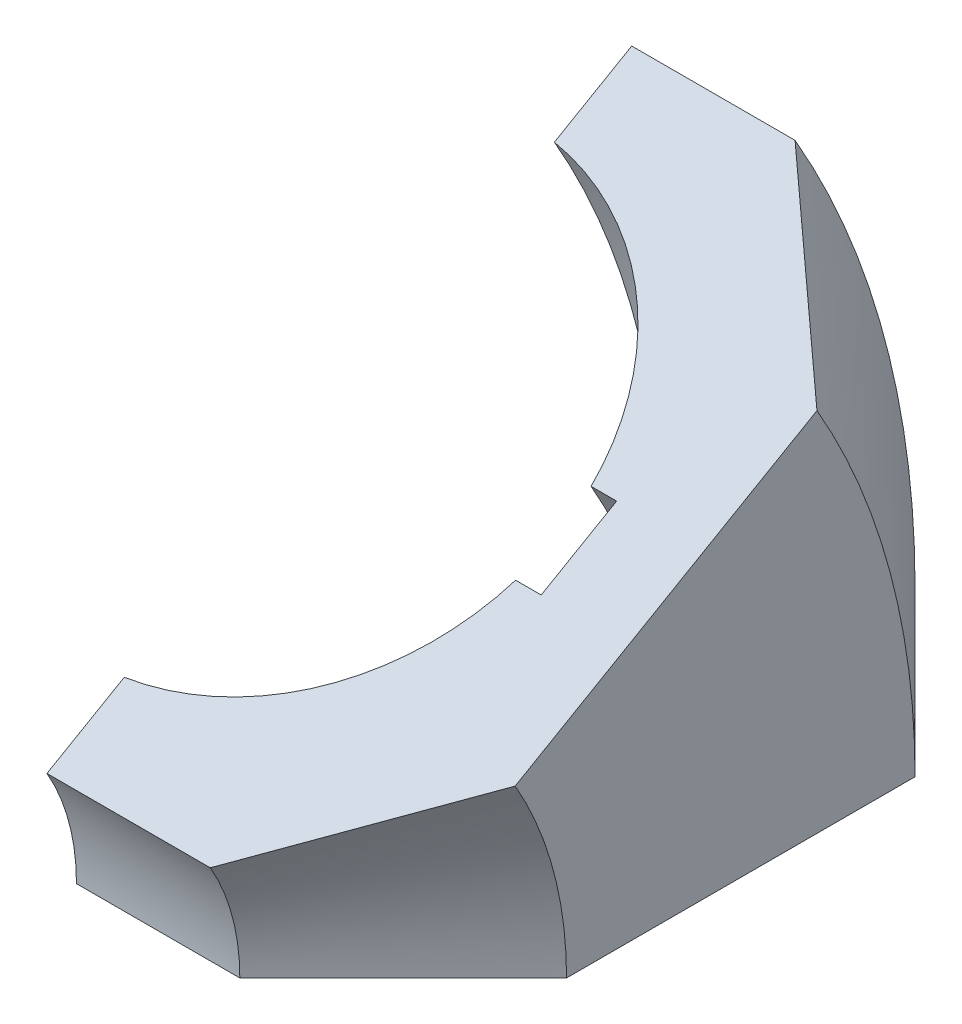
ISO-10303-21;
HEADER;
FILE_DESCRIPTION(('STEP AP214'),'2;1');
FILE_NAME('part.step','',(''),(''),'','','');
FILE_SCHEMA(('AUTOMOTIVE_DESIGN { 1 0 10303 214 1 1 1 1 }'));
ENDSEC;
DATA;
#1=APPLICATION_CONTEXT('core data for automotive mechanical design processes');
#2=APPLICATION_PROTOCOL_DEFINITION('international standard','automotive_design',2000,#1);
#3=PRODUCT_CONTEXT('',#1,'mechanical');
#4=PRODUCT('Part','Part','',(#3));
#5=PRODUCT_RELATED_PRODUCT_CATEGORY('part','',(#4));
#6=PRODUCT_DEFINITION_FORMATION('','',#4);
#7=PRODUCT_DEFINITION_CONTEXT('part definition',#1,'design');
#8=PRODUCT_DEFINITION('design','',#6,#7);
#9=PRODUCT_DEFINITION_SHAPE('','',#8);
#10=(LENGTH_UNIT() NAMED_UNIT(*) SI_UNIT(.MILLI.,.METRE.));
#11=(NAMED_UNIT(*) PLANE_ANGLE_UNIT() SI_UNIT($,.RADIAN.));
#12=(NAMED_UNIT(*) SI_UNIT($,.STERADIAN.) SOLID_ANGLE_UNIT());
#13=UNCERTAINTY_MEASURE_WITH_UNIT(LENGTH_MEASURE(1.E-05),#10,'distance_accuracy_value','');
#14=(GEOMETRIC_REPRESENTATION_CONTEXT(3) GLOBAL_UNCERTAINTY_ASSIGNED_CONTEXT((#13)) GLOBAL_UNIT_ASSIGNED_CONTEXT((#10,
#11,#12)) REPRESENTATION_CONTEXT('',''));
#15=CARTESIAN_POINT('',(0.,0.,0.));
#16=DIRECTION('',(0.,0.,1.));
#17=DIRECTION('',(1.,0.,0.));
#18=AXIS2_PLACEMENT_3D('',#15,#16,#17);
#19=CARTESIAN_POINT('',(0.,25.6217782649108,6.86533479473208));
#20=DIRECTION('',(0.,-0.866025403784447,-0.499999999999986));
#21=DIRECTION('',(0.,0.499999999999986,-0.866025403784447));
#22=AXIS2_PLACEMENT_3D('',#19,#20,#21);
#23=PLANE('',#22);
#24=DIRECTION('',(1.,0.,0.));
#25=VECTOR('',#24,1.);
#26=CARTESIAN_POINT('',(33.,10.1217782649112,33.71212231205));
#27=LINE('',#26,#25);
#28=CARTESIAN_POINT('',(3.00000000000001,10.1217782649112,33.71212231205));
#29=VERTEX_POINT('',#28);
#30=CARTESIAN_POINT('',(18.,10.1217782649112,33.71212231205));
#31=VERTEX_POINT('',#30);
#32=EDGE_CURVE('E209',#29,#31,#27,.T.);
#33=ORIENTED_EDGE('',*,*,#32,.T.);
#34=DIRECTION('',(0.707106781186549,0.353553390593264,-0.612372435695799));
#35=VECTOR('',#34,1.);
#36=CARTESIAN_POINT('',(-2.24355652982317,0.,51.2435565298233));
#37=LINE('',#36,#35);
#38=CARTESIAN_POINT('',(33.,17.621778264911,20.7217412552833));
#39=VERTEX_POINT('',#38);
#40=EDGE_CURVE('E48',#31,#39,#37,.T.);
#41=ORIENTED_EDGE('',*,*,#40,.T.);
#42=DIRECTION('',(0.,0.499999999999986,-0.866025403784447));
#43=VECTOR('',#42,1.);
#44=CARTESIAN_POINT('',(33.,41.1217782649103,-19.9814527225857));
#45=LINE('',#44,#43);
#46=CARTESIAN_POINT('',(33.,33.6217782649105,-6.99107166581893));
#47=VERTEX_POINT('',#46);
#48=EDGE_CURVE('E219',#39,#47,#45,.T.);
#49=ORIENTED_EDGE('',*,*,#48,.T.);
#50=DIRECTION('',(0.707106781186546,-0.353553390593265,0.612372435695802));
#51=VECTOR('',#50,1.);
#52=CARTESIAN_POINT('',(100.243556529823,0.,51.2435565298233));
#53=LINE('',#52,#51);
#54=CARTESIAN_POINT('',(18.,41.1217782649103,-19.9814527225857));
#55=VERTEX_POINT('',#54);
#56=EDGE_CURVE('E55',#47,#55,#53,.F.);
#57=ORIENTED_EDGE('',*,*,#56,.T.);
#58=DIRECTION('',(-1.,0.,0.));
#59=VECTOR('',#58,1.);
#60=CARTESIAN_POINT('',(3.,41.1217782649103,-19.9814527225857));
#61=LINE('',#60,#59);
#62=CARTESIAN_POINT('',(3.,41.1217782649103,-19.9814527225857));
#63=VERTEX_POINT('',#62);
#64=EDGE_CURVE('E145',#55,#63,#61,.T.);
#65=ORIENTED_EDGE('',*,*,#64,.T.);
#66=DIRECTION('',(0.,-0.499999999999986,0.866025403784447));
#67=VECTOR('',#66,1.);
#68=CARTESIAN_POINT('',(3.00000000000001,37.0235325159018,-12.8830828633995));
#69=LINE('',#68,#67);
#70=CARTESIAN_POINT('',(3.00000000000001,37.0235325159018,-12.8830828633995));
#71=VERTEX_POINT('',#70);
#72=EDGE_CURVE('E144',#63,#71,#69,.T.);
#73=ORIENTED_EDGE('',*,*,#72,.T.);
#74=CARTESIAN_POINT('',(0.,25.6217782649108,6.86533479473216));
#75=DIRECTION('',(0.,-0.866025403784447,-0.499999999999986));
#76=DIRECTION('',(0.,0.499999999999986,-0.866025403784447));
#77=AXIS2_PLACEMENT_3D('',#74,#75,#76);
#78=CIRCLE('',#77,23.);
#79=CARTESIAN_POINT('',(22.6495033058122,27.6217782649107,3.40123317959437));
#80=VERTEX_POINT('',#79);
#81=EDGE_CURVE('E132',#71,#80,#78,.T.);
#82=ORIENTED_EDGE('',*,*,#81,.T.);
#83=DIRECTION('',(1.,0.,0.));
#84=VECTOR('',#83,1.);
#85=CARTESIAN_POINT('',(25.,27.6217782649107,3.40123317959437));
#86=LINE('',#85,#84);
#87=CARTESIAN_POINT('',(25.,27.6217782649107,3.40123317959437));
#88=VERTEX_POINT('',#87);
#89=EDGE_CURVE('E141',#80,#88,#86,.T.);
#90=ORIENTED_EDGE('',*,*,#89,.T.);
#91=DIRECTION('',(0.,-0.499999999999986,0.866025403784447));
#92=VECTOR('',#91,1.);
#93=CARTESIAN_POINT('',(25.,27.6217782649107,3.40123317959437));
#94=LINE('',#93,#92);
#95=CARTESIAN_POINT('',(25.,23.6217782649108,10.3294364098699));
#96=VERTEX_POINT('',#95);
#97=EDGE_CURVE('E164',#88,#96,#94,.T.);
#98=ORIENTED_EDGE('',*,*,#97,.T.);
#99=DIRECTION('',(-1.,0.,0.));
#100=VECTOR('',#99,1.);
#101=CARTESIAN_POINT('',(22.6495033058122,23.6217782649108,10.3294364098699));
#102=LINE('',#101,#100);
#103=CARTESIAN_POINT('',(22.6495033058122,23.6217782649108,10.3294364098699));
#104=VERTEX_POINT('',#103);
#105=EDGE_CURVE('E176',#96,#104,#102,.T.);
#106=ORIENTED_EDGE('',*,*,#105,.T.);
#107=CARTESIAN_POINT('',(0.,25.6217782649108,6.86533479473208));
#108=DIRECTION('',(0.,-0.866025403784447,-0.499999999999986));
#109=DIRECTION('',(0.,0.499999999999986,-0.866025403784447));
#110=AXIS2_PLACEMENT_3D('',#107,#108,#109);
#111=CIRCLE('',#110,23.0000000000001);
#112=CARTESIAN_POINT('',(3.00000000000001,14.2200240139197,26.6137524528638));
#113=VERTEX_POINT('',#112);
#114=EDGE_CURVE('E187',#104,#113,#111,.T.);
#115=ORIENTED_EDGE('',*,*,#114,.T.);
#116=DIRECTION('',(0.,-0.499999999999986,0.866025403784447));
#117=VECTOR('',#116,1.);
#118=CARTESIAN_POINT('',(3.00000000000001,10.1217782649112,33.71212231205));
#119=LINE('',#118,#117);
#120=EDGE_CURVE('E198',#113,#29,#119,.T.);
#121=ORIENTED_EDGE('',*,*,#120,.T.);
#122=EDGE_LOOP('',(#33,#41,#49,#57,#65,#73,#82,#90,#98,#106,#115,#121));
#123=FACE_BOUND('',#122,.T.);
#124=ADVANCED_FACE('F39',(#123),#23,.F.);
#125=CARTESIAN_POINT('',(0.,0.,0.));
#126=DIRECTION('',(0.,-1.,0.));
#127=DIRECTION('',(0.,0.,-1.));
#128=AXIS2_PLACEMENT_3D('',#125,#126,#127);
#129=PLANE('',#128);
#130=DIRECTION('',(0.,0.,-1.));
#131=VECTOR('',#130,1.);
#132=CARTESIAN_POINT('',(33.,0.,-31.));
#133=LINE('',#132,#131);
#134=CARTESIAN_POINT('',(33.,0.,16.));
#135=VERTEX_POINT('',#134);
#136=CARTESIAN_POINT('',(33.,0.,-15.9999999999999));
#137=VERTEX_POINT('',#136);
#138=EDGE_CURVE('E222',#135,#137,#133,.T.);
#139=ORIENTED_EDGE('',*,*,#138,.F.);
#140=DIRECTION('',(0.707106781186549,0.,-0.707106781186546));
#141=VECTOR('',#140,1.);
#142=CARTESIAN_POINT('',(-2.24355652982317,0.,51.2435565298231));
#143=LINE('',#142,#141);
#144=CARTESIAN_POINT('',(18.,0.,31.));
#145=VERTEX_POINT('',#144);
#146=EDGE_CURVE('E248',#135,#145,#143,.F.);
#147=ORIENTED_EDGE('',*,*,#146,.T.);
#148=DIRECTION('',(1.,0.,0.));
#149=VECTOR('',#148,1.);
#150=CARTESIAN_POINT('',(33.,0.,31.));
#151=LINE('',#150,#149);
#152=CARTESIAN_POINT('',(3.00000000000001,0.,31.));
#153=VERTEX_POINT('',#152);
#154=EDGE_CURVE('E216',#153,#145,#151,.T.);
#155=ORIENTED_EDGE('',*,*,#154,.F.);
#156=DIRECTION('',(0.,0.,1.));
#157=VECTOR('',#156,1.);
#158=CARTESIAN_POINT('',(3.00000000000001,0.,31.));
#159=LINE('',#158,#157);
#160=CARTESIAN_POINT('',(3.00000000000001,0.,22.8035085019828));
#161=VERTEX_POINT('',#160);
#162=EDGE_CURVE('E205',#161,#153,#159,.T.);
#163=ORIENTED_EDGE('',*,*,#162,.F.);
#164=CARTESIAN_POINT('',(0.,0.,0.));
#165=DIRECTION('',(0.,-1.,0.));
#166=DIRECTION('',(0.,0.,-1.));
#167=AXIS2_PLACEMENT_3D('',#164,#165,#166);
#168=CIRCLE('',#167,23.0000000000001);
#169=CARTESIAN_POINT('',(22.6495033058122,0.,4.));
#170=VERTEX_POINT('',#169);
#171=EDGE_CURVE('E194',#170,#161,#168,.T.);
#172=ORIENTED_EDGE('',*,*,#171,.F.);
#173=DIRECTION('',(-1.,0.,0.));
#174=VECTOR('',#173,1.);
#175=CARTESIAN_POINT('',(22.6495033058122,0.,4.));
#176=LINE('',#175,#174);
#177=CARTESIAN_POINT('',(25.,0.,4.));
#178=VERTEX_POINT('',#177);
#179=EDGE_CURVE('E183',#178,#170,#176,.T.);
#180=ORIENTED_EDGE('',*,*,#179,.F.);
#181=DIRECTION('',(0.,0.,1.));
#182=VECTOR('',#181,1.);
#183=CARTESIAN_POINT('',(25.,0.,-4.));
#184=LINE('',#183,#182);
#185=CARTESIAN_POINT('',(25.,0.,-4.));
#186=VERTEX_POINT('',#185);
#187=EDGE_CURVE('E172',#186,#178,#184,.T.);
#188=ORIENTED_EDGE('',*,*,#187,.F.);
#189=DIRECTION('',(1.,0.,0.));
#190=VECTOR('',#189,1.);
#191=CARTESIAN_POINT('',(25.,0.,-4.));
#192=LINE('',#191,#190);
#193=CARTESIAN_POINT('',(22.6495033058122,0.,-4.));
#194=VERTEX_POINT('',#193);
#195=EDGE_CURVE('E165',#194,#186,#192,.T.);
#196=ORIENTED_EDGE('',*,*,#195,.F.);
#197=CARTESIAN_POINT('',(0.,0.,0.));
#198=DIRECTION('',(0.,-1.,0.));
#199=DIRECTION('',(0.,0.,-1.));
#200=AXIS2_PLACEMENT_3D('',#197,#198,#199);
#201=CIRCLE('',#200,23.);
#202=CARTESIAN_POINT('',(3.00000000000001,0.,-22.8035085019828));
#203=VERTEX_POINT('',#202);
#204=EDGE_CURVE('E156',#203,#194,#201,.T.);
#205=ORIENTED_EDGE('',*,*,#204,.F.);
#206=DIRECTION('',(0.,0.,1.));
#207=VECTOR('',#206,1.);
#208=CARTESIAN_POINT('',(3.00000000000001,0.,-22.8035085019828));
#209=LINE('',#208,#207);
#210=CARTESIAN_POINT('',(3.,0.,-31.));
#211=VERTEX_POINT('',#210);
#212=EDGE_CURVE('E153',#211,#203,#209,.T.);
#213=ORIENTED_EDGE('',*,*,#212,.F.);
#214=DIRECTION('',(-1.,0.,0.));
#215=VECTOR('',#214,1.);
#216=CARTESIAN_POINT('',(3.,0.,-31.));
#217=LINE('',#216,#215);
#218=CARTESIAN_POINT('',(18.,0.,-31.));
#219=VERTEX_POINT('',#218);
#220=EDGE_CURVE('E228',#219,#211,#217,.T.);
#221=ORIENTED_EDGE('',*,*,#220,.F.);
#222=DIRECTION('',(0.707106781186546,0.,0.707106781186549));
#223=VECTOR('',#222,1.);
#224=CARTESIAN_POINT('',(100.243556529823,0.,51.2435565298231));
#225=LINE('',#224,#223);
#226=EDGE_CURVE('E245',#219,#137,#225,.T.);
#227=ORIENTED_EDGE('',*,*,#226,.T.);
#228=EDGE_LOOP('',(#139,#147,#155,#163,#172,#180,#188,#196,#205,#213,#221,#227));
#229=FACE_BOUND('',#228,.T.);
#230=ADVANCED_FACE('F266',(#229),#129,.T.);
#231=CARTESIAN_POINT('',(0.,-4.5102810375397E-13,51.2435565298231));
#232=DIRECTION('',(-1.,0.,0.));
#233=DIRECTION('',(0.,0.,1.));
#234=AXIS2_PLACEMENT_3D('',#231,#232,#233);
#235=TOROIDAL_SURFACE('',#234,51.2435565298231,23.);
#236=CARTESIAN_POINT('',(22.6495033058122,-4.5102810375397E-13,51.2435565298231));
#237=DIRECTION('',(-1.,0.,0.));
#238=DIRECTION('',(0.,0.499999999999993,-0.866025403784442));
#239=AXIS2_PLACEMENT_3D('',#236,#237,#238);
#240=CIRCLE('',#239,55.2435565298231);
#241=EDGE_CURVE('E138',#80,#194,#240,.T.);
#242=ORIENTED_EDGE('',*,*,#241,.F.);
#243=ORIENTED_EDGE('',*,*,#81,.F.);
#244=CARTESIAN_POINT('',(3.00000000000001,-4.5102810375397E-13,51.2435565298231));
#245=DIRECTION('',(-1.,0.,0.));
#246=DIRECTION('',(0.,0.499999999999992,-0.866025403784443));
#247=AXIS2_PLACEMENT_3D('',#244,#245,#246);
#248=CIRCLE('',#247,74.0470650318058);
#249=EDGE_CURVE('E136',#71,#203,#248,.T.);
#250=ORIENTED_EDGE('',*,*,#249,.T.);
#251=ORIENTED_EDGE('',*,*,#204,.T.);
#252=EDGE_LOOP('',(#242,#243,#250,#251));
#253=FACE_BOUND('',#252,.T.);
#254=ADVANCED_FACE('F134',(#253),#235,.F.);
#255=CARTESIAN_POINT('',(0.,-4.5102810375397E-13,51.2435565298231));
#256=DIRECTION('',(-1.,0.,0.));
#257=DIRECTION('',(0.,0.,1.));
#258=AXIS2_PLACEMENT_3D('',#255,#256,#257);
#259=CYLINDRICAL_SURFACE('',#258,55.2435565298231);
#260=CARTESIAN_POINT('',(25.,-4.5102810375397E-13,51.2435565298231));
#261=DIRECTION('',(-1.,0.,0.));
#262=DIRECTION('',(0.,0.499999999999993,-0.866025403784442));
#263=AXIS2_PLACEMENT_3D('',#260,#261,#262);
#264=CIRCLE('',#263,55.2435565298231);
#265=EDGE_CURVE('E168',#88,#186,#264,.T.);
#266=ORIENTED_EDGE('',*,*,#265,.F.);
#267=ORIENTED_EDGE('',*,*,#89,.F.);
#268=ORIENTED_EDGE('',*,*,#241,.T.);
#269=ORIENTED_EDGE('',*,*,#195,.T.);
#270=EDGE_LOOP('',(#266,#267,#268,#269));
#271=FACE_BOUND('',#270,.T.);
#272=ADVANCED_FACE('F287',(#271),#259,.F.);
#273=CARTESIAN_POINT('',(25.,27.6217782649107,3.40123317959437));
#274=DIRECTION('',(1.,0.,0.));
#275=DIRECTION('',(0.,0.,-1.));
#276=AXIS2_PLACEMENT_3D('',#273,#274,#275);
#277=PLANE('',#276);
#278=CARTESIAN_POINT('',(25.,-4.5102810375397E-13,51.2435565298231));
#279=DIRECTION('',(-1.,0.,0.));
#280=DIRECTION('',(0.,0.499999999999995,-0.866025403784442));
#281=AXIS2_PLACEMENT_3D('',#278,#279,#280);
#282=CIRCLE('',#281,47.2435565298231);
#283=EDGE_CURVE('E179',#96,#178,#282,.T.);
#284=ORIENTED_EDGE('',*,*,#283,.F.);
#285=ORIENTED_EDGE('',*,*,#97,.F.);
#286=ORIENTED_EDGE('',*,*,#265,.T.);
#287=ORIENTED_EDGE('',*,*,#187,.T.);
#288=EDGE_LOOP('',(#284,#285,#286,#287));
#289=FACE_BOUND('',#288,.T.);
#290=ADVANCED_FACE('F283',(#289),#277,.F.);
#291=CARTESIAN_POINT('',(0.,-4.5102810375397E-13,51.2435565298231));
#292=DIRECTION('',(-1.,0.,0.));
#293=DIRECTION('',(0.,0.,1.));
#294=AXIS2_PLACEMENT_3D('',#291,#292,#293);
#295=CYLINDRICAL_SURFACE('',#294,47.2435565298231);
#296=CARTESIAN_POINT('',(22.6495033058122,-4.5102810375397E-13,51.2435565298231));
#297=DIRECTION('',(-1.,0.,0.));
#298=DIRECTION('',(0.,0.499999999999995,-0.866025403784442));
#299=AXIS2_PLACEMENT_3D('',#296,#297,#298);
#300=CIRCLE('',#299,47.2435565298231);
#301=EDGE_CURVE('E190',#104,#170,#300,.T.);
#302=ORIENTED_EDGE('',*,*,#301,.F.);
#303=ORIENTED_EDGE('',*,*,#105,.F.);
#304=ORIENTED_EDGE('',*,*,#283,.T.);
#305=ORIENTED_EDGE('',*,*,#179,.T.);
#306=EDGE_LOOP('',(#302,#303,#304,#305));
#307=FACE_BOUND('',#306,.T.);
#308=ADVANCED_FACE('F280',(#307),#295,.T.);
#309=CARTESIAN_POINT('',(0.,-4.5102810375397E-13,51.2435565298231));
#310=DIRECTION('',(-1.,0.,0.));
#311=DIRECTION('',(0.,0.,1.));
#312=AXIS2_PLACEMENT_3D('',#309,#310,#311);
#313=TOROIDAL_SURFACE('',#312,51.2435565298231,23.0000000000001);
#314=CARTESIAN_POINT('',(3.00000000000001,-4.5102810375397E-13,51.2435565298231));
#315=DIRECTION('',(-1.,0.,0.));
#316=DIRECTION('',(0.,0.5,-0.866025403784439));
#317=AXIS2_PLACEMENT_3D('',#314,#315,#316);
#318=CIRCLE('',#317,28.4400480278403);
#319=EDGE_CURVE('E201',#113,#161,#318,.T.);
#320=ORIENTED_EDGE('',*,*,#319,.F.);
#321=ORIENTED_EDGE('',*,*,#114,.F.);
#322=ORIENTED_EDGE('',*,*,#301,.T.);
#323=ORIENTED_EDGE('',*,*,#171,.T.);
#324=EDGE_LOOP('',(#320,#321,#322,#323));
#325=FACE_BOUND('',#324,.T.);
#326=ADVANCED_FACE('F278',(#325),#313,.F.);
#327=CARTESIAN_POINT('',(3.00000000000001,10.1217782649112,33.71212231205));
#328=DIRECTION('',(1.,0.,0.));
#329=DIRECTION('',(0.,0.,-1.));
#330=AXIS2_PLACEMENT_3D('',#327,#328,#329);
#331=PLANE('',#330);
#332=CARTESIAN_POINT('',(3.00000000000001,-4.5102810375397E-13,51.2435565298231));
#333=DIRECTION('',(-1.,0.,0.));
#334=DIRECTION('',(0.,0.500000000000006,-0.866025403784435));
#335=AXIS2_PLACEMENT_3D('',#332,#333,#334);
#336=CIRCLE('',#335,20.2435565298231);
#337=EDGE_CURVE('E212',#29,#153,#336,.T.);
#338=ORIENTED_EDGE('',*,*,#337,.F.);
#339=ORIENTED_EDGE('',*,*,#120,.F.);
#340=ORIENTED_EDGE('',*,*,#319,.T.);
#341=ORIENTED_EDGE('',*,*,#162,.T.);
#342=EDGE_LOOP('',(#338,#339,#340,#341));
#343=FACE_BOUND('',#342,.T.);
#344=ADVANCED_FACE('F271',(#343),#331,.F.);
#345=CARTESIAN_POINT('',(0.,-4.5102810375397E-13,51.2435565298231));
#346=DIRECTION('',(-1.,0.,0.));
#347=DIRECTION('',(0.,0.,1.));
#348=AXIS2_PLACEMENT_3D('',#345,#346,#347);
#349=CYLINDRICAL_SURFACE('',#348,20.2435565298231);
#350=ORIENTED_EDGE('',*,*,#154,.T.);
#351=CARTESIAN_POINT('',(18.,-4.5102810375397E-13,51.2435565298231));
#352=DIRECTION('',(-1.,0.,0.));
#353=DIRECTION('',(0.,0.,1.));
#354=AXIS2_PLACEMENT_3D('',#351,#352,#353);
#355=CIRCLE('',#354,20.2435565298231);
#356=EDGE_CURVE('E63',#145,#31,#355,.F.);
#357=ORIENTED_EDGE('',*,*,#356,.T.);
#358=ORIENTED_EDGE('',*,*,#32,.F.);
#359=ORIENTED_EDGE('',*,*,#337,.T.);
#360=EDGE_LOOP('',(#350,#357,#358,#359));
#361=FACE_BOUND('',#360,.T.);
#362=ADVANCED_FACE('F268',(#361),#349,.F.);
#363=CARTESIAN_POINT('',(33.,41.1217782649103,-19.9814527225857));
#364=DIRECTION('',(-1.,0.,0.));
#365=DIRECTION('',(0.,0.,1.));
#366=AXIS2_PLACEMENT_3D('',#363,#364,#365);
#367=PLANE('',#366);
#368=ORIENTED_EDGE('',*,*,#48,.F.);
#369=CARTESIAN_POINT('',(33.,-4.5102810375397E-13,51.2435565298231));
#370=DIRECTION('',(-1.,0.,0.));
#371=DIRECTION('',(0.,0.,1.));
#372=AXIS2_PLACEMENT_3D('',#369,#370,#371);
#373=CIRCLE('',#372,35.2435565298231);
#374=EDGE_CURVE('E241',#39,#135,#373,.T.);
#375=ORIENTED_EDGE('',*,*,#374,.T.);
#376=ORIENTED_EDGE('',*,*,#138,.T.);
#377=CARTESIAN_POINT('',(33.,-4.5102810375397E-13,51.2435565298231));
#378=DIRECTION('',(-1.,0.,0.));
#379=DIRECTION('',(0.,0.,1.));
#380=AXIS2_PLACEMENT_3D('',#377,#378,#379);
#381=CIRCLE('',#380,67.243556529823);
#382=EDGE_CURVE('E238',#137,#47,#381,.F.);
#383=ORIENTED_EDGE('',*,*,#382,.T.);
#384=EDGE_LOOP('',(#368,#375,#376,#383));
#385=FACE_BOUND('',#384,.T.);
#386=ADVANCED_FACE('F260',(#385),#367,.F.);
#387=CARTESIAN_POINT('',(0.,-4.5102810375397E-13,51.2435565298231));
#388=DIRECTION('',(-1.,0.,0.));
#389=DIRECTION('',(0.,0.,1.));
#390=AXIS2_PLACEMENT_3D('',#387,#388,#389);
#391=CYLINDRICAL_SURFACE('',#390,82.2435565298231);
#392=ORIENTED_EDGE('',*,*,#64,.F.);
#393=CARTESIAN_POINT('',(18.,-4.5102810375397E-13,51.2435565298231));
#394=DIRECTION('',(-1.,0.,0.));
#395=DIRECTION('',(0.,0.,1.));
#396=AXIS2_PLACEMENT_3D('',#393,#394,#395);
#397=CIRCLE('',#396,82.2435565298231);
#398=EDGE_CURVE('E11',#55,#219,#397,.T.);
#399=ORIENTED_EDGE('',*,*,#398,.T.);
#400=ORIENTED_EDGE('',*,*,#220,.T.);
#401=CARTESIAN_POINT('',(3.,-4.5102810375397E-13,51.2435565298231));
#402=DIRECTION('',(-1.,0.,0.));
#403=DIRECTION('',(0.,0.499999999999991,-0.866025403784444));
#404=AXIS2_PLACEMENT_3D('',#401,#402,#403);
#405=CIRCLE('',#404,82.2435565298231);
#406=EDGE_CURVE('E233',#63,#211,#405,.T.);
#407=ORIENTED_EDGE('',*,*,#406,.F.);
#408=EDGE_LOOP('',(#392,#399,#400,#407));
#409=FACE_BOUND('',#408,.T.);
#410=ADVANCED_FACE('F298',(#409),#391,.T.);
#411=CARTESIAN_POINT('',(3.,37.0235325159018,-12.8830828633995));
#412=DIRECTION('',(1.,0.,0.));
#413=DIRECTION('',(0.,0.,-1.));
#414=AXIS2_PLACEMENT_3D('',#411,#412,#413);
#415=PLANE('',#414);
#416=ORIENTED_EDGE('',*,*,#212,.T.);
#417=ORIENTED_EDGE('',*,*,#249,.F.);
#418=ORIENTED_EDGE('',*,*,#72,.F.);
#419=ORIENTED_EDGE('',*,*,#406,.T.);
#420=EDGE_LOOP('',(#416,#417,#418,#419));
#421=FACE_BOUND('',#420,.T.);
#422=ADVANCED_FACE('F151',(#421),#415,.F.);
#423=CARTESIAN_POINT('',(33.,-4.5102810375397E-13,51.2435565298231));
#424=DIRECTION('',(1.,0.,0.));
#425=DIRECTION('',(0.,0.,-1.));
#426=AXIS2_PLACEMENT_3D('',#423,#424,#425);
#427=CONICAL_SURFACE('',#426,35.2435565298231,0.785398163397447);
#428=ORIENTED_EDGE('',*,*,#40,.F.);
#429=ORIENTED_EDGE('',*,*,#356,.F.);
#430=ORIENTED_EDGE('',*,*,#146,.F.);
#431=ORIENTED_EDGE('',*,*,#374,.F.);
#432=EDGE_LOOP('',(#428,#429,#430,#431));
#433=FACE_BOUND('',#432,.T.);
#434=ADVANCED_FACE('F263',(#433),#427,.F.);
#435=CARTESIAN_POINT('',(18.,-4.5102810375397E-13,51.2435565298231));
#436=DIRECTION('',(-1.,0.,0.));
#437=DIRECTION('',(0.,0.,1.));
#438=AXIS2_PLACEMENT_3D('',#435,#436,#437);
#439=CONICAL_SURFACE('',#438,82.2435565298231,0.78539816339745);
#440=ORIENTED_EDGE('',*,*,#56,.F.);
#441=ORIENTED_EDGE('',*,*,#382,.F.);
#442=ORIENTED_EDGE('',*,*,#226,.F.);
#443=ORIENTED_EDGE('',*,*,#398,.F.);
#444=EDGE_LOOP('',(#440,#441,#442,#443));
#445=FACE_BOUND('',#444,.T.);
#446=ADVANCED_FACE('F41',(#445),#439,.T.);
#447=CLOSED_SHELL('',(#124,#230,#254,#272,#290,#308,#326,#344,#362,#386,#410,#422,#434,#446));
#448=MANIFOLD_SOLID_BREP('B2',#447);
#449=ADVANCED_BREP_SHAPE_REPRESENTATION('',(#18,#448),#14);
#450=SHAPE_DEFINITION_REPRESENTATION(#9,#449);
ENDSEC;
END-ISO-10303-21;
